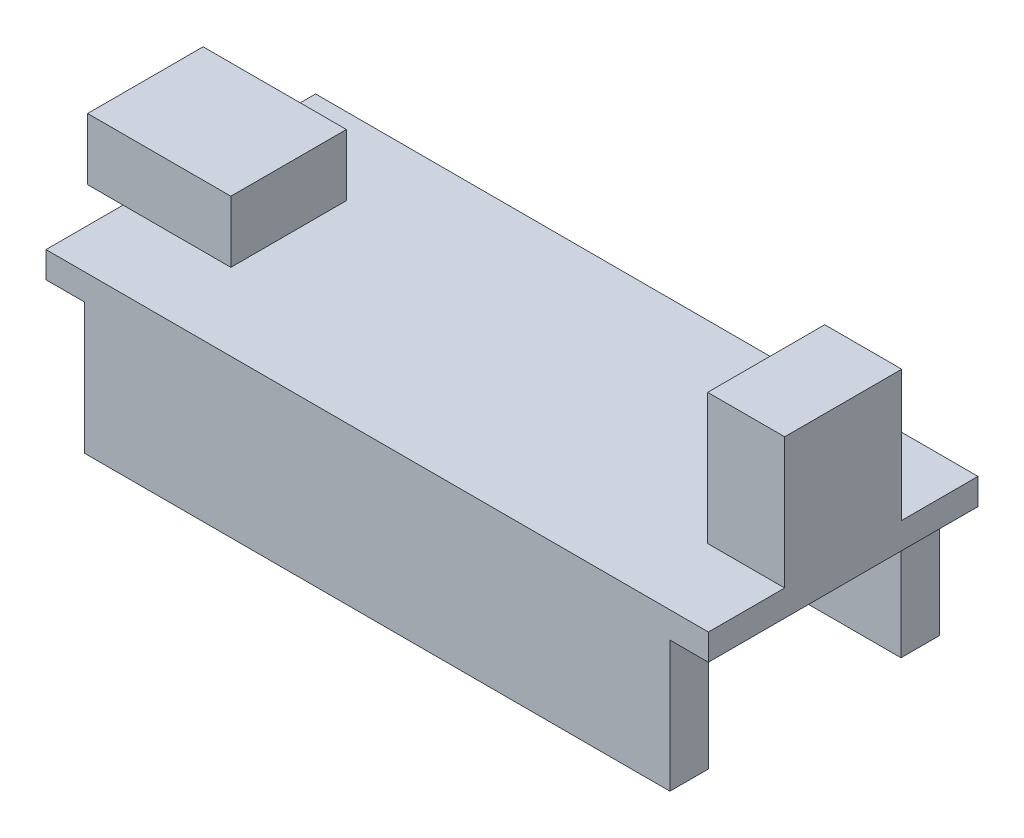
ISO-10303-21;
HEADER;
FILE_DESCRIPTION(('STEP AP214'),'2;1');
FILE_NAME('part.step','',(''),(''),'','','');
FILE_SCHEMA(('AUTOMOTIVE_DESIGN { 1 0 10303 214 1 1 1 1 }'));
ENDSEC;
DATA;
#1=APPLICATION_CONTEXT('core data for automotive mechanical design processes');
#2=APPLICATION_PROTOCOL_DEFINITION('international standard','automotive_design',2000,#1);
#3=PRODUCT_CONTEXT('',#1,'mechanical');
#4=PRODUCT('Part','Part','',(#3));
#5=PRODUCT_RELATED_PRODUCT_CATEGORY('part','',(#4));
#6=PRODUCT_DEFINITION_FORMATION('','',#4);
#7=PRODUCT_DEFINITION_CONTEXT('part definition',#1,'design');
#8=PRODUCT_DEFINITION('design','',#6,#7);
#9=PRODUCT_DEFINITION_SHAPE('','',#8);
#10=(LENGTH_UNIT() NAMED_UNIT(*) SI_UNIT(.MILLI.,.METRE.));
#11=(NAMED_UNIT(*) PLANE_ANGLE_UNIT() SI_UNIT($,.RADIAN.));
#12=(NAMED_UNIT(*) SI_UNIT($,.STERADIAN.) SOLID_ANGLE_UNIT());
#13=UNCERTAINTY_MEASURE_WITH_UNIT(LENGTH_MEASURE(1.E-05),#10,'distance_accuracy_value','');
#14=(GEOMETRIC_REPRESENTATION_CONTEXT(3) GLOBAL_UNCERTAINTY_ASSIGNED_CONTEXT((#13)) GLOBAL_UNIT_ASSIGNED_CONTEXT((#10,
#11,#12)) REPRESENTATION_CONTEXT('',''));
#15=CARTESIAN_POINT('',(0.,0.,0.));
#16=DIRECTION('',(0.,0.,1.));
#17=DIRECTION('',(1.,0.,0.));
#18=AXIS2_PLACEMENT_3D('',#15,#16,#17);
#19=CARTESIAN_POINT('',(0.,0.,0.));
#20=DIRECTION('',(0.,1.,0.));
#21=DIRECTION('',(0.,0.,1.));
#22=AXIS2_PLACEMENT_3D('',#19,#20,#21);
#23=PLANE('',#22);
#24=DIRECTION('',(0.,0.,-1.));
#25=VECTOR('',#24,1.);
#26=CARTESIAN_POINT('',(-19.,0.,-8.75));
#27=LINE('',#26,#25);
#28=CARTESIAN_POINT('',(-19.,0.,-6.25));
#29=VERTEX_POINT('',#28);
#30=CARTESIAN_POINT('',(-19.,0.,-8.75));
#31=VERTEX_POINT('',#30);
#32=EDGE_CURVE('E52',#29,#31,#27,.T.);
#33=ORIENTED_EDGE('',*,*,#32,.F.);
#34=DIRECTION('',(-1.,0.,0.));
#35=VECTOR('',#34,1.);
#36=CARTESIAN_POINT('',(-19.,0.,-6.25));
#37=LINE('',#36,#35);
#38=CARTESIAN_POINT('',(19.,0.,-6.25));
#39=VERTEX_POINT('',#38);
#40=EDGE_CURVE('E198',#39,#29,#37,.T.);
#41=ORIENTED_EDGE('',*,*,#40,.F.);
#42=DIRECTION('',(0.,0.,1.));
#43=VECTOR('',#42,1.);
#44=CARTESIAN_POINT('',(19.,0.,-8.75));
#45=LINE('',#44,#43);
#46=CARTESIAN_POINT('',(19.,0.,-8.75));
#47=VERTEX_POINT('',#46);
#48=EDGE_CURVE('E312',#47,#39,#45,.T.);
#49=ORIENTED_EDGE('',*,*,#48,.F.);
#50=DIRECTION('',(-1.,0.,0.));
#51=VECTOR('',#50,1.);
#52=CARTESIAN_POINT('',(-21.5,0.,-8.75));
#53=LINE('',#52,#51);
#54=CARTESIAN_POINT('',(21.5,0.,-8.75));
#55=VERTEX_POINT('',#54);
#56=EDGE_CURVE('E287',#55,#47,#53,.T.);
#57=ORIENTED_EDGE('',*,*,#56,.F.);
#58=DIRECTION('',(0.,0.,-1.));
#59=VECTOR('',#58,1.);
#60=CARTESIAN_POINT('',(21.5,0.,-8.75));
#61=LINE('',#60,#59);
#62=CARTESIAN_POINT('',(21.5,0.,8.75));
#63=VERTEX_POINT('',#62);
#64=EDGE_CURVE('E283',#63,#55,#61,.T.);
#65=ORIENTED_EDGE('',*,*,#64,.F.);
#66=DIRECTION('',(1.,0.,0.));
#67=VECTOR('',#66,1.);
#68=CARTESIAN_POINT('',(-21.5,0.,8.75));
#69=LINE('',#68,#67);
#70=CARTESIAN_POINT('',(19.,0.,8.75));
#71=VERTEX_POINT('',#70);
#72=EDGE_CURVE('E244',#71,#63,#69,.T.);
#73=ORIENTED_EDGE('',*,*,#72,.F.);
#74=DIRECTION('',(0.,0.,1.));
#75=VECTOR('',#74,1.);
#76=CARTESIAN_POINT('',(19.,0.,8.75));
#77=LINE('',#76,#75);
#78=CARTESIAN_POINT('',(19.,0.,6.25));
#79=VERTEX_POINT('',#78);
#80=EDGE_CURVE('E213',#79,#71,#77,.T.);
#81=ORIENTED_EDGE('',*,*,#80,.F.);
#82=DIRECTION('',(1.,0.,0.));
#83=VECTOR('',#82,1.);
#84=CARTESIAN_POINT('',(-19.,0.,6.25));
#85=LINE('',#84,#83);
#86=CARTESIAN_POINT('',(-19.,0.,6.25));
#87=VERTEX_POINT('',#86);
#88=EDGE_CURVE('E60',#87,#79,#85,.T.);
#89=ORIENTED_EDGE('',*,*,#88,.F.);
#90=DIRECTION('',(0.,0.,-1.));
#91=VECTOR('',#90,1.);
#92=CARTESIAN_POINT('',(-19.,0.,8.75));
#93=LINE('',#92,#91);
#94=CARTESIAN_POINT('',(-19.,0.,8.75));
#95=VERTEX_POINT('',#94);
#96=EDGE_CURVE('E201',#95,#87,#93,.T.);
#97=ORIENTED_EDGE('',*,*,#96,.F.);
#98=CARTESIAN_POINT('',(-21.5,0.,8.75));
#99=VERTEX_POINT('',#98);
#100=EDGE_CURVE('E247',#99,#95,#69,.T.);
#101=ORIENTED_EDGE('',*,*,#100,.F.);
#102=DIRECTION('',(0.,0.,1.));
#103=VECTOR('',#102,1.);
#104=CARTESIAN_POINT('',(-21.5,0.,-8.75));
#105=LINE('',#104,#103);
#106=CARTESIAN_POINT('',(-21.5,0.,-8.75));
#107=VERTEX_POINT('',#106);
#108=EDGE_CURVE('E248',#107,#99,#105,.T.);
#109=ORIENTED_EDGE('',*,*,#108,.F.);
#110=EDGE_CURVE('E285',#31,#107,#53,.T.);
#111=ORIENTED_EDGE('',*,*,#110,.F.);
#112=EDGE_LOOP('',(#33,#41,#49,#57,#65,#73,#81,#89,#97,#101,#109,#111));
#113=FACE_BOUND('',#112,.T.);
#114=ADVANCED_FACE('F35',(#113),#23,.F.);
#115=CARTESIAN_POINT('',(0.,1.7,0.));
#116=DIRECTION('',(0.,1.,0.));
#117=DIRECTION('',(0.,0.,1.));
#118=AXIS2_PLACEMENT_3D('',#115,#116,#117);
#119=PLANE('',#118);
#120=DIRECTION('',(-1.,0.,0.));
#121=VECTOR('',#120,1.);
#122=CARTESIAN_POINT('',(0.,1.7,3.75));
#123=LINE('',#122,#121);
#124=CARTESIAN_POINT('',(-14.5,1.7,3.75));
#125=VERTEX_POINT('',#124);
#126=CARTESIAN_POINT('',(-21.5,1.7,3.75));
#127=VERTEX_POINT('',#126);
#128=EDGE_CURVE('E571',#125,#127,#123,.T.);
#129=ORIENTED_EDGE('',*,*,#128,.T.);
#130=DIRECTION('',(0.,0.,1.));
#131=VECTOR('',#130,1.);
#132=CARTESIAN_POINT('',(-21.5,1.7,-8.75));
#133=LINE('',#132,#131);
#134=CARTESIAN_POINT('',(-21.5,1.7,8.75));
#135=VERTEX_POINT('',#134);
#136=EDGE_CURVE('E277',#127,#135,#133,.T.);
#137=ORIENTED_EDGE('',*,*,#136,.T.);
#138=DIRECTION('',(1.,0.,0.));
#139=VECTOR('',#138,1.);
#140=CARTESIAN_POINT('',(-21.5,1.7,8.75));
#141=LINE('',#140,#139);
#142=CARTESIAN_POINT('',(21.5,1.7,8.75));
#143=VERTEX_POINT('',#142);
#144=EDGE_CURVE('E259',#135,#143,#141,.T.);
#145=ORIENTED_EDGE('',*,*,#144,.T.);
#146=DIRECTION('',(0.,0.,-1.));
#147=VECTOR('',#146,1.);
#148=CARTESIAN_POINT('',(21.5,1.7,-8.75));
#149=LINE('',#148,#147);
#150=CARTESIAN_POINT('',(21.5,1.7,3.8));
#151=VERTEX_POINT('',#150);
#152=EDGE_CURVE('E264',#143,#151,#149,.T.);
#153=ORIENTED_EDGE('',*,*,#152,.T.);
#154=DIRECTION('',(-1.,0.,0.));
#155=VECTOR('',#154,1.);
#156=CARTESIAN_POINT('',(0.,1.7,3.8));
#157=LINE('',#156,#155);
#158=CARTESIAN_POINT('',(16.5,1.7,3.8));
#159=VERTEX_POINT('',#158);
#160=EDGE_CURVE('E551',#151,#159,#157,.T.);
#161=ORIENTED_EDGE('',*,*,#160,.T.);
#162=DIRECTION('',(0.,0.,1.));
#163=VECTOR('',#162,1.);
#164=CARTESIAN_POINT('',(16.5,1.7,0.));
#165=LINE('',#164,#163);
#166=CARTESIAN_POINT('',(16.5,1.7,-3.8));
#167=VERTEX_POINT('',#166);
#168=EDGE_CURVE('E533',#167,#159,#165,.T.);
#169=ORIENTED_EDGE('',*,*,#168,.F.);
#170=DIRECTION('',(-1.,0.,0.));
#171=VECTOR('',#170,1.);
#172=CARTESIAN_POINT('',(0.,1.7,-3.8));
#173=LINE('',#172,#171);
#174=CARTESIAN_POINT('',(21.5,1.7,-3.8));
#175=VERTEX_POINT('',#174);
#176=EDGE_CURVE('E302',#175,#167,#173,.T.);
#177=ORIENTED_EDGE('',*,*,#176,.F.);
#178=CARTESIAN_POINT('',(21.5,1.7,-8.75));
#179=VERTEX_POINT('',#178);
#180=EDGE_CURVE('E268',#175,#179,#149,.T.);
#181=ORIENTED_EDGE('',*,*,#180,.T.);
#182=DIRECTION('',(-1.,0.,0.));
#183=VECTOR('',#182,1.);
#184=CARTESIAN_POINT('',(-21.5,1.7,-8.75));
#185=LINE('',#184,#183);
#186=CARTESIAN_POINT('',(-21.5,1.7,-8.75));
#187=VERTEX_POINT('',#186);
#188=EDGE_CURVE('E267',#179,#187,#185,.T.);
#189=ORIENTED_EDGE('',*,*,#188,.T.);
#190=CARTESIAN_POINT('',(-21.5,1.7,-3.75));
#191=VERTEX_POINT('',#190);
#192=EDGE_CURVE('E278',#187,#191,#133,.T.);
#193=ORIENTED_EDGE('',*,*,#192,.T.);
#194=DIRECTION('',(-1.,0.,0.));
#195=VECTOR('',#194,1.);
#196=CARTESIAN_POINT('',(0.,1.7,-3.75));
#197=LINE('',#196,#195);
#198=CARTESIAN_POINT('',(-14.5,1.7,-3.75));
#199=VERTEX_POINT('',#198);
#200=EDGE_CURVE('E591',#199,#191,#197,.T.);
#201=ORIENTED_EDGE('',*,*,#200,.F.);
#202=DIRECTION('',(0.,0.,1.));
#203=VECTOR('',#202,1.);
#204=CARTESIAN_POINT('',(-14.5,1.7,0.));
#205=LINE('',#204,#203);
#206=EDGE_CURVE('E573',#199,#125,#205,.T.);
#207=ORIENTED_EDGE('',*,*,#206,.T.);
#208=EDGE_LOOP('',(#129,#137,#145,#153,#161,#169,#177,#181,#189,#193,#201,#207));
#209=FACE_BOUND('',#208,.T.);
#210=ADVANCED_FACE('F300',(#209),#119,.T.);
#211=CARTESIAN_POINT('',(21.5,1.7,-8.75));
#212=DIRECTION('',(-1.,0.,0.));
#213=DIRECTION('',(0.,0.,1.));
#214=AXIS2_PLACEMENT_3D('',#211,#212,#213);
#215=PLANE('',#214);
#216=ORIENTED_EDGE('',*,*,#64,.T.);
#217=DIRECTION('',(0.,-1.,0.));
#218=VECTOR('',#217,1.);
#219=CARTESIAN_POINT('',(21.5,1.7,-8.75));
#220=LINE('',#219,#218);
#221=EDGE_CURVE('E11',#179,#55,#220,.T.);
#222=ORIENTED_EDGE('',*,*,#221,.F.);
#223=ORIENTED_EDGE('',*,*,#180,.F.);
#224=DIRECTION('',(0.,-1.,0.));
#225=VECTOR('',#224,1.);
#226=CARTESIAN_POINT('',(21.5,10.2,-3.8));
#227=LINE('',#226,#225);
#228=CARTESIAN_POINT('',(21.5,10.2,-3.8));
#229=VERTEX_POINT('',#228);
#230=EDGE_CURVE('E286',#229,#175,#227,.T.);
#231=ORIENTED_EDGE('',*,*,#230,.F.);
#232=DIRECTION('',(0.,0.,-1.));
#233=VECTOR('',#232,1.);
#234=CARTESIAN_POINT('',(21.5,10.2,0.));
#235=LINE('',#234,#233);
#236=CARTESIAN_POINT('',(21.5,10.2,3.8));
#237=VERTEX_POINT('',#236);
#238=EDGE_CURVE('E553',#237,#229,#235,.T.);
#239=ORIENTED_EDGE('',*,*,#238,.F.);
#240=DIRECTION('',(0.,-1.,0.));
#241=VECTOR('',#240,1.);
#242=CARTESIAN_POINT('',(21.5,10.2,3.8));
#243=LINE('',#242,#241);
#244=EDGE_CURVE('E541',#237,#151,#243,.T.);
#245=ORIENTED_EDGE('',*,*,#244,.T.);
#246=ORIENTED_EDGE('',*,*,#152,.F.);
#247=DIRECTION('',(0.,-1.,0.));
#248=VECTOR('',#247,1.);
#249=CARTESIAN_POINT('',(21.5,1.7,8.75));
#250=LINE('',#249,#248);
#251=EDGE_CURVE('E254',#143,#63,#250,.T.);
#252=ORIENTED_EDGE('',*,*,#251,.T.);
#253=EDGE_LOOP('',(#216,#222,#223,#231,#239,#245,#246,#252));
#254=FACE_BOUND('',#253,.T.);
#255=ADVANCED_FACE('F37',(#254),#215,.F.);
#256=CARTESIAN_POINT('',(-21.5,1.7,-8.75));
#257=DIRECTION('',(0.,0.,1.));
#258=DIRECTION('',(1.,0.,0.));
#259=AXIS2_PLACEMENT_3D('',#256,#257,#258);
#260=PLANE('',#259);
#261=ORIENTED_EDGE('',*,*,#56,.T.);
#262=DIRECTION('',(0.,1.,0.));
#263=VECTOR('',#262,1.);
#264=CARTESIAN_POINT('',(19.,-8.5,-8.75));
#265=LINE('',#264,#263);
#266=CARTESIAN_POINT('',(19.,-8.5,-8.75));
#267=VERTEX_POINT('',#266);
#268=EDGE_CURVE('E187',#267,#47,#265,.T.);
#269=ORIENTED_EDGE('',*,*,#268,.F.);
#270=DIRECTION('',(1.,0.,0.));
#271=VECTOR('',#270,1.);
#272=CARTESIAN_POINT('',(-19.,-8.5,-8.75));
#273=LINE('',#272,#271);
#274=CARTESIAN_POINT('',(-19.,-8.5,-8.75));
#275=VERTEX_POINT('',#274);
#276=EDGE_CURVE('E181',#275,#267,#273,.T.);
#277=ORIENTED_EDGE('',*,*,#276,.F.);
#278=DIRECTION('',(0.,1.,0.));
#279=VECTOR('',#278,1.);
#280=CARTESIAN_POINT('',(-19.,-8.5,-8.75));
#281=LINE('',#280,#279);
#282=EDGE_CURVE('E185',#275,#31,#281,.T.);
#283=ORIENTED_EDGE('',*,*,#282,.T.);
#284=ORIENTED_EDGE('',*,*,#110,.T.);
#285=DIRECTION('',(0.,-1.,0.));
#286=VECTOR('',#285,1.);
#287=CARTESIAN_POINT('',(-21.5,1.7,-8.75));
#288=LINE('',#287,#286);
#289=EDGE_CURVE('E44',#187,#107,#288,.T.);
#290=ORIENTED_EDGE('',*,*,#289,.F.);
#291=ORIENTED_EDGE('',*,*,#188,.F.);
#292=ORIENTED_EDGE('',*,*,#221,.T.);
#293=EDGE_LOOP('',(#261,#269,#277,#283,#284,#290,#291,#292));
#294=FACE_BOUND('',#293,.T.);
#295=ADVANCED_FACE('F184',(#294),#260,.F.);
#296=CARTESIAN_POINT('',(-21.5,1.7,-8.75));
#297=DIRECTION('',(1.,0.,0.));
#298=DIRECTION('',(0.,0.,-1.));
#299=AXIS2_PLACEMENT_3D('',#296,#297,#298);
#300=PLANE('',#299);
#301=ORIENTED_EDGE('',*,*,#108,.T.);
#302=DIRECTION('',(0.,-1.,0.));
#303=VECTOR('',#302,1.);
#304=CARTESIAN_POINT('',(-21.5,1.7,8.75));
#305=LINE('',#304,#303);
#306=EDGE_CURVE('E258',#135,#99,#305,.T.);
#307=ORIENTED_EDGE('',*,*,#306,.F.);
#308=ORIENTED_EDGE('',*,*,#136,.F.);
#309=EDGE_CURVE('E281',#191,#127,#133,.T.);
#310=ORIENTED_EDGE('',*,*,#309,.F.);
#311=ORIENTED_EDGE('',*,*,#192,.F.);
#312=ORIENTED_EDGE('',*,*,#289,.T.);
#313=EDGE_LOOP('',(#301,#307,#308,#310,#311,#312));
#314=FACE_BOUND('',#313,.T.);
#315=ADVANCED_FACE('F293',(#314),#300,.F.);
#316=CARTESIAN_POINT('',(-21.5,1.7,8.75));
#317=DIRECTION('',(0.,0.,-1.));
#318=DIRECTION('',(-1.,0.,0.));
#319=AXIS2_PLACEMENT_3D('',#316,#317,#318);
#320=PLANE('',#319);
#321=ORIENTED_EDGE('',*,*,#100,.T.);
#322=DIRECTION('',(0.,1.,0.));
#323=VECTOR('',#322,1.);
#324=CARTESIAN_POINT('',(-19.,-8.5,8.75));
#325=LINE('',#324,#323);
#326=CARTESIAN_POINT('',(-19.,-8.5,8.75));
#327=VERTEX_POINT('',#326);
#328=EDGE_CURVE('E219',#327,#95,#325,.T.);
#329=ORIENTED_EDGE('',*,*,#328,.F.);
#330=DIRECTION('',(-1.,0.,0.));
#331=VECTOR('',#330,1.);
#332=CARTESIAN_POINT('',(-19.,-8.5,8.75));
#333=LINE('',#332,#331);
#334=CARTESIAN_POINT('',(19.,-8.5,8.75));
#335=VERTEX_POINT('',#334);
#336=EDGE_CURVE('E217',#335,#327,#333,.T.);
#337=ORIENTED_EDGE('',*,*,#336,.F.);
#338=DIRECTION('',(0.,1.,0.));
#339=VECTOR('',#338,1.);
#340=CARTESIAN_POINT('',(19.,-8.5,8.75));
#341=LINE('',#340,#339);
#342=EDGE_CURVE('E230',#335,#71,#341,.T.);
#343=ORIENTED_EDGE('',*,*,#342,.T.);
#344=ORIENTED_EDGE('',*,*,#72,.T.);
#345=ORIENTED_EDGE('',*,*,#251,.F.);
#346=ORIENTED_EDGE('',*,*,#144,.F.);
#347=ORIENTED_EDGE('',*,*,#306,.T.);
#348=EDGE_LOOP('',(#321,#329,#337,#343,#344,#345,#346,#347));
#349=FACE_BOUND('',#348,.T.);
#350=ADVANCED_FACE('F343',(#349),#320,.F.);
#351=CARTESIAN_POINT('',(0.,10.2,-3.8));
#352=DIRECTION('',(0.,0.,1.));
#353=DIRECTION('',(1.,0.,0.));
#354=AXIS2_PLACEMENT_3D('',#351,#352,#353);
#355=PLANE('',#354);
#356=ORIENTED_EDGE('',*,*,#176,.T.);
#357=DIRECTION('',(0.,-1.,0.));
#358=VECTOR('',#357,1.);
#359=CARTESIAN_POINT('',(16.5,10.2,-3.8));
#360=LINE('',#359,#358);
#361=CARTESIAN_POINT('',(16.5,10.2,-3.8));
#362=VERTEX_POINT('',#361);
#363=EDGE_CURVE('E273',#362,#167,#360,.T.);
#364=ORIENTED_EDGE('',*,*,#363,.F.);
#365=DIRECTION('',(-1.,0.,0.));
#366=VECTOR('',#365,1.);
#367=CARTESIAN_POINT('',(0.,10.2,-3.8));
#368=LINE('',#367,#366);
#369=EDGE_CURVE('E560',#229,#362,#368,.T.);
#370=ORIENTED_EDGE('',*,*,#369,.F.);
#371=ORIENTED_EDGE('',*,*,#230,.T.);
#372=EDGE_LOOP('',(#356,#364,#370,#371));
#373=FACE_BOUND('',#372,.T.);
#374=ADVANCED_FACE('F346',(#373),#355,.F.);
#375=CARTESIAN_POINT('',(16.5,10.2,0.));
#376=DIRECTION('',(1.,0.,0.));
#377=DIRECTION('',(0.,0.,-1.));
#378=AXIS2_PLACEMENT_3D('',#375,#376,#377);
#379=PLANE('',#378);
#380=ORIENTED_EDGE('',*,*,#168,.T.);
#381=DIRECTION('',(0.,-1.,0.));
#382=VECTOR('',#381,1.);
#383=CARTESIAN_POINT('',(16.5,10.2,3.8));
#384=LINE('',#383,#382);
#385=CARTESIAN_POINT('',(16.5,10.2,3.8));
#386=VERTEX_POINT('',#385);
#387=EDGE_CURVE('E538',#386,#159,#384,.T.);
#388=ORIENTED_EDGE('',*,*,#387,.F.);
#389=DIRECTION('',(0.,0.,1.));
#390=VECTOR('',#389,1.);
#391=CARTESIAN_POINT('',(16.5,10.2,0.));
#392=LINE('',#391,#390);
#393=EDGE_CURVE('E537',#362,#386,#392,.T.);
#394=ORIENTED_EDGE('',*,*,#393,.F.);
#395=ORIENTED_EDGE('',*,*,#363,.T.);
#396=EDGE_LOOP('',(#380,#388,#394,#395));
#397=FACE_BOUND('',#396,.T.);
#398=ADVANCED_FACE('F524',(#397),#379,.F.);
#399=CARTESIAN_POINT('',(0.,10.2,3.8));
#400=DIRECTION('',(0.,0.,1.));
#401=DIRECTION('',(1.,0.,0.));
#402=AXIS2_PLACEMENT_3D('',#399,#400,#401);
#403=PLANE('',#402);
#404=ORIENTED_EDGE('',*,*,#160,.F.);
#405=ORIENTED_EDGE('',*,*,#244,.F.);
#406=DIRECTION('',(-1.,0.,0.));
#407=VECTOR('',#406,1.);
#408=CARTESIAN_POINT('',(0.,10.2,3.8));
#409=LINE('',#408,#407);
#410=EDGE_CURVE('E545',#237,#386,#409,.T.);
#411=ORIENTED_EDGE('',*,*,#410,.T.);
#412=ORIENTED_EDGE('',*,*,#387,.T.);
#413=EDGE_LOOP('',(#404,#405,#411,#412));
#414=FACE_BOUND('',#413,.T.);
#415=ADVANCED_FACE('F520',(#414),#403,.T.);
#416=CARTESIAN_POINT('',(0.,10.2,0.));
#417=DIRECTION('',(0.,1.,0.));
#418=DIRECTION('',(0.,0.,1.));
#419=AXIS2_PLACEMENT_3D('',#416,#417,#418);
#420=PLANE('',#419);
#421=ORIENTED_EDGE('',*,*,#238,.T.);
#422=ORIENTED_EDGE('',*,*,#369,.T.);
#423=ORIENTED_EDGE('',*,*,#393,.T.);
#424=ORIENTED_EDGE('',*,*,#410,.F.);
#425=EDGE_LOOP('',(#421,#422,#423,#424));
#426=FACE_BOUND('',#425,.T.);
#427=ADVANCED_FACE('F367',(#426),#420,.T.);
#428=CARTESIAN_POINT('',(0.,1.7,0.));
#429=DIRECTION('',(0.,1.,0.));
#430=DIRECTION('',(0.,0.,1.));
#431=AXIS2_PLACEMENT_3D('',#428,#429,#430);
#432=PLANE('',#431);
#433=CARTESIAN_POINT('',(-23.8,1.7,-3.75));
#434=VERTEX_POINT('',#433);
#435=EDGE_CURVE('E581',#191,#434,#197,.T.);
#436=ORIENTED_EDGE('',*,*,#435,.F.);
#437=ORIENTED_EDGE('',*,*,#309,.T.);
#438=CARTESIAN_POINT('',(-23.8,1.7,3.75));
#439=VERTEX_POINT('',#438);
#440=EDGE_CURVE('E576',#127,#439,#123,.T.);
#441=ORIENTED_EDGE('',*,*,#440,.T.);
#442=DIRECTION('',(0.,0.,1.));
#443=VECTOR('',#442,1.);
#444=CARTESIAN_POINT('',(-23.8,1.7,0.));
#445=LINE('',#444,#443);
#446=EDGE_CURVE('E586',#434,#439,#445,.T.);
#447=ORIENTED_EDGE('',*,*,#446,.F.);
#448=EDGE_LOOP('',(#436,#437,#441,#447));
#449=FACE_BOUND('',#448,.T.);
#450=ADVANCED_FACE('F379',(#449),#432,.F.);
#451=CARTESIAN_POINT('',(-23.8,5.7,0.));
#452=DIRECTION('',(1.,0.,0.));
#453=DIRECTION('',(0.,0.,-1.));
#454=AXIS2_PLACEMENT_3D('',#451,#452,#453);
#455=PLANE('',#454);
#456=ORIENTED_EDGE('',*,*,#446,.T.);
#457=DIRECTION('',(0.,-1.,0.));
#458=VECTOR('',#457,1.);
#459=CARTESIAN_POINT('',(-23.8,5.7,3.75));
#460=LINE('',#459,#458);
#461=CARTESIAN_POINT('',(-23.8,5.7,3.75));
#462=VERTEX_POINT('',#461);
#463=EDGE_CURVE('E534',#462,#439,#460,.T.);
#464=ORIENTED_EDGE('',*,*,#463,.F.);
#465=DIRECTION('',(0.,0.,1.));
#466=VECTOR('',#465,1.);
#467=CARTESIAN_POINT('',(-23.8,5.7,0.));
#468=LINE('',#467,#466);
#469=CARTESIAN_POINT('',(-23.8,5.7,-3.75));
#470=VERTEX_POINT('',#469);
#471=EDGE_CURVE('E593',#470,#462,#468,.T.);
#472=ORIENTED_EDGE('',*,*,#471,.F.);
#473=DIRECTION('',(0.,-1.,0.));
#474=VECTOR('',#473,1.);
#475=CARTESIAN_POINT('',(-23.8,5.7,-3.75));
#476=LINE('',#475,#474);
#477=EDGE_CURVE('E594',#470,#434,#476,.T.);
#478=ORIENTED_EDGE('',*,*,#477,.T.);
#479=EDGE_LOOP('',(#456,#464,#472,#478));
#480=FACE_BOUND('',#479,.T.);
#481=ADVANCED_FACE('F384',(#480),#455,.F.);
#482=CARTESIAN_POINT('',(0.,5.7,3.75));
#483=DIRECTION('',(0.,0.,1.));
#484=DIRECTION('',(1.,0.,0.));
#485=AXIS2_PLACEMENT_3D('',#482,#483,#484);
#486=PLANE('',#485);
#487=ORIENTED_EDGE('',*,*,#128,.F.);
#488=DIRECTION('',(0.,-1.,0.));
#489=VECTOR('',#488,1.);
#490=CARTESIAN_POINT('',(-14.5,5.7,3.75));
#491=LINE('',#490,#489);
#492=CARTESIAN_POINT('',(-14.5,5.7,3.75));
#493=VERTEX_POINT('',#492);
#494=EDGE_CURVE('E600',#493,#125,#491,.T.);
#495=ORIENTED_EDGE('',*,*,#494,.F.);
#496=DIRECTION('',(-1.,0.,0.));
#497=VECTOR('',#496,1.);
#498=CARTESIAN_POINT('',(0.,5.7,3.75));
#499=LINE('',#498,#497);
#500=EDGE_CURVE('E605',#493,#462,#499,.T.);
#501=ORIENTED_EDGE('',*,*,#500,.T.);
#502=ORIENTED_EDGE('',*,*,#463,.T.);
#503=ORIENTED_EDGE('',*,*,#440,.F.);
#504=EDGE_LOOP('',(#487,#495,#501,#502,#503));
#505=FACE_BOUND('',#504,.T.);
#506=ADVANCED_FACE('F395',(#505),#486,.T.);
#507=CARTESIAN_POINT('',(-14.5,5.7,0.));
#508=DIRECTION('',(1.,0.,0.));
#509=DIRECTION('',(0.,0.,-1.));
#510=AXIS2_PLACEMENT_3D('',#507,#508,#509);
#511=PLANE('',#510);
#512=ORIENTED_EDGE('',*,*,#206,.F.);
#513=DIRECTION('',(0.,-1.,0.));
#514=VECTOR('',#513,1.);
#515=CARTESIAN_POINT('',(-14.5,5.7,-3.75));
#516=LINE('',#515,#514);
#517=CARTESIAN_POINT('',(-14.5,5.7,-3.75));
#518=VERTEX_POINT('',#517);
#519=EDGE_CURVE('E597',#518,#199,#516,.T.);
#520=ORIENTED_EDGE('',*,*,#519,.F.);
#521=DIRECTION('',(0.,0.,1.));
#522=VECTOR('',#521,1.);
#523=CARTESIAN_POINT('',(-14.5,5.7,0.));
#524=LINE('',#523,#522);
#525=EDGE_CURVE('E603',#518,#493,#524,.T.);
#526=ORIENTED_EDGE('',*,*,#525,.T.);
#527=ORIENTED_EDGE('',*,*,#494,.T.);
#528=EDGE_LOOP('',(#512,#520,#526,#527));
#529=FACE_BOUND('',#528,.T.);
#530=ADVANCED_FACE('F405',(#529),#511,.T.);
#531=CARTESIAN_POINT('',(0.,5.7,-3.75));
#532=DIRECTION('',(0.,0.,1.));
#533=DIRECTION('',(1.,0.,0.));
#534=AXIS2_PLACEMENT_3D('',#531,#532,#533);
#535=PLANE('',#534);
#536=ORIENTED_EDGE('',*,*,#200,.T.);
#537=ORIENTED_EDGE('',*,*,#435,.T.);
#538=ORIENTED_EDGE('',*,*,#477,.F.);
#539=DIRECTION('',(-1.,0.,0.));
#540=VECTOR('',#539,1.);
#541=CARTESIAN_POINT('',(0.,5.7,-3.75));
#542=LINE('',#541,#540);
#543=EDGE_CURVE('E598',#518,#470,#542,.T.);
#544=ORIENTED_EDGE('',*,*,#543,.F.);
#545=ORIENTED_EDGE('',*,*,#519,.T.);
#546=EDGE_LOOP('',(#536,#537,#538,#544,#545));
#547=FACE_BOUND('',#546,.T.);
#548=ADVANCED_FACE('F415',(#547),#535,.F.);
#549=CARTESIAN_POINT('',(0.,5.7,0.));
#550=DIRECTION('',(0.,1.,0.));
#551=DIRECTION('',(0.,0.,1.));
#552=AXIS2_PLACEMENT_3D('',#549,#550,#551);
#553=PLANE('',#552);
#554=ORIENTED_EDGE('',*,*,#471,.T.);
#555=ORIENTED_EDGE('',*,*,#500,.F.);
#556=ORIENTED_EDGE('',*,*,#525,.F.);
#557=ORIENTED_EDGE('',*,*,#543,.T.);
#558=EDGE_LOOP('',(#554,#555,#556,#557));
#559=FACE_BOUND('',#558,.T.);
#560=ADVANCED_FACE('F425',(#559),#553,.T.);
#561=CARTESIAN_POINT('',(-19.,-8.5,8.75));
#562=DIRECTION('',(1.,0.,0.));
#563=DIRECTION('',(0.,0.,-1.));
#564=AXIS2_PLACEMENT_3D('',#561,#562,#563);
#565=PLANE('',#564);
#566=ORIENTED_EDGE('',*,*,#96,.T.);
#567=DIRECTION('',(0.,1.,0.));
#568=VECTOR('',#567,1.);
#569=CARTESIAN_POINT('',(-19.,-8.5,6.25));
#570=LINE('',#569,#568);
#571=CARTESIAN_POINT('',(-19.,-8.5,6.25));
#572=VERTEX_POINT('',#571);
#573=EDGE_CURVE('E236',#572,#87,#570,.T.);
#574=ORIENTED_EDGE('',*,*,#573,.F.);
#575=DIRECTION('',(0.,0.,-1.));
#576=VECTOR('',#575,1.);
#577=CARTESIAN_POINT('',(-19.,-8.5,8.75));
#578=LINE('',#577,#576);
#579=EDGE_CURVE('E209',#327,#572,#578,.T.);
#580=ORIENTED_EDGE('',*,*,#579,.F.);
#581=ORIENTED_EDGE('',*,*,#328,.T.);
#582=EDGE_LOOP('',(#566,#574,#580,#581));
#583=FACE_BOUND('',#582,.T.);
#584=ADVANCED_FACE('F435',(#583),#565,.F.);
#585=CARTESIAN_POINT('',(-19.,-8.5,6.25));
#586=DIRECTION('',(0.,0.,1.));
#587=DIRECTION('',(1.,0.,0.));
#588=AXIS2_PLACEMENT_3D('',#585,#586,#587);
#589=PLANE('',#588);
#590=ORIENTED_EDGE('',*,*,#88,.T.);
#591=DIRECTION('',(0.,1.,0.));
#592=VECTOR('',#591,1.);
#593=CARTESIAN_POINT('',(19.,-8.5,6.25));
#594=LINE('',#593,#592);
#595=CARTESIAN_POINT('',(19.,-8.5,6.25));
#596=VERTEX_POINT('',#595);
#597=EDGE_CURVE('E223',#596,#79,#594,.T.);
#598=ORIENTED_EDGE('',*,*,#597,.F.);
#599=DIRECTION('',(1.,0.,0.));
#600=VECTOR('',#599,1.);
#601=CARTESIAN_POINT('',(-19.,-8.5,6.25));
#602=LINE('',#601,#600);
#603=EDGE_CURVE('E212',#572,#596,#602,.T.);
#604=ORIENTED_EDGE('',*,*,#603,.F.);
#605=ORIENTED_EDGE('',*,*,#573,.T.);
#606=EDGE_LOOP('',(#590,#598,#604,#605));
#607=FACE_BOUND('',#606,.T.);
#608=ADVANCED_FACE('F462',(#607),#589,.F.);
#609=CARTESIAN_POINT('',(19.,-8.5,8.75));
#610=DIRECTION('',(-1.,0.,0.));
#611=DIRECTION('',(0.,0.,1.));
#612=AXIS2_PLACEMENT_3D('',#609,#610,#611);
#613=PLANE('',#612);
#614=ORIENTED_EDGE('',*,*,#80,.T.);
#615=ORIENTED_EDGE('',*,*,#342,.F.);
#616=DIRECTION('',(0.,0.,1.));
#617=VECTOR('',#616,1.);
#618=CARTESIAN_POINT('',(19.,-8.5,8.75));
#619=LINE('',#618,#617);
#620=EDGE_CURVE('E215',#596,#335,#619,.T.);
#621=ORIENTED_EDGE('',*,*,#620,.F.);
#622=ORIENTED_EDGE('',*,*,#597,.T.);
#623=EDGE_LOOP('',(#614,#615,#621,#622));
#624=FACE_BOUND('',#623,.T.);
#625=ADVANCED_FACE('F471',(#624),#613,.F.);
#626=CARTESIAN_POINT('',(0.,-8.5,0.));
#627=DIRECTION('',(0.,-1.,0.));
#628=DIRECTION('',(0.,0.,-1.));
#629=AXIS2_PLACEMENT_3D('',#626,#627,#628);
#630=PLANE('',#629);
#631=ORIENTED_EDGE('',*,*,#579,.T.);
#632=ORIENTED_EDGE('',*,*,#603,.T.);
#633=ORIENTED_EDGE('',*,*,#620,.T.);
#634=ORIENTED_EDGE('',*,*,#336,.T.);
#635=EDGE_LOOP('',(#631,#632,#633,#634));
#636=FACE_BOUND('',#635,.T.);
#637=ADVANCED_FACE('F333',(#636),#630,.T.);
#638=CARTESIAN_POINT('',(-19.,-8.5,-8.75));
#639=DIRECTION('',(1.,0.,0.));
#640=DIRECTION('',(0.,0.,-1.));
#641=AXIS2_PLACEMENT_3D('',#638,#639,#640);
#642=PLANE('',#641);
#643=ORIENTED_EDGE('',*,*,#32,.T.);
#644=ORIENTED_EDGE('',*,*,#282,.F.);
#645=DIRECTION('',(0.,0.,-1.));
#646=VECTOR('',#645,1.);
#647=CARTESIAN_POINT('',(-19.,-8.5,-8.75));
#648=LINE('',#647,#646);
#649=CARTESIAN_POINT('',(-19.,-8.5,-6.25));
#650=VERTEX_POINT('',#649);
#651=EDGE_CURVE('E191',#650,#275,#648,.T.);
#652=ORIENTED_EDGE('',*,*,#651,.F.);
#653=DIRECTION('',(0.,1.,0.));
#654=VECTOR('',#653,1.);
#655=CARTESIAN_POINT('',(-19.,-8.5,-6.25));
#656=LINE('',#655,#654);
#657=EDGE_CURVE('E321',#650,#29,#656,.T.);
#658=ORIENTED_EDGE('',*,*,#657,.T.);
#659=EDGE_LOOP('',(#643,#644,#652,#658));
#660=FACE_BOUND('',#659,.T.);
#661=ADVANCED_FACE('F200',(#660),#642,.F.);
#662=CARTESIAN_POINT('',(19.,-8.5,-8.75));
#663=DIRECTION('',(-1.,0.,0.));
#664=DIRECTION('',(0.,0.,1.));
#665=AXIS2_PLACEMENT_3D('',#662,#663,#664);
#666=PLANE('',#665);
#667=ORIENTED_EDGE('',*,*,#48,.T.);
#668=DIRECTION('',(0.,1.,0.));
#669=VECTOR('',#668,1.);
#670=CARTESIAN_POINT('',(19.,-8.5,-6.25));
#671=LINE('',#670,#669);
#672=CARTESIAN_POINT('',(19.,-8.5,-6.25));
#673=VERTEX_POINT('',#672);
#674=EDGE_CURVE('E205',#673,#39,#671,.T.);
#675=ORIENTED_EDGE('',*,*,#674,.F.);
#676=DIRECTION('',(0.,0.,1.));
#677=VECTOR('',#676,1.);
#678=CARTESIAN_POINT('',(19.,-8.5,-8.75));
#679=LINE('',#678,#677);
#680=EDGE_CURVE('E190',#267,#673,#679,.T.);
#681=ORIENTED_EDGE('',*,*,#680,.F.);
#682=ORIENTED_EDGE('',*,*,#268,.T.);
#683=EDGE_LOOP('',(#667,#675,#681,#682));
#684=FACE_BOUND('',#683,.T.);
#685=ADVANCED_FACE('F324',(#684),#666,.F.);
#686=CARTESIAN_POINT('',(-19.,-8.5,-6.25));
#687=DIRECTION('',(0.,0.,-1.));
#688=DIRECTION('',(-1.,0.,0.));
#689=AXIS2_PLACEMENT_3D('',#686,#687,#688);
#690=PLANE('',#689);
#691=ORIENTED_EDGE('',*,*,#40,.T.);
#692=ORIENTED_EDGE('',*,*,#657,.F.);
#693=DIRECTION('',(-1.,0.,0.));
#694=VECTOR('',#693,1.);
#695=CARTESIAN_POINT('',(-19.,-8.5,-6.25));
#696=LINE('',#695,#694);
#697=EDGE_CURVE('E196',#673,#650,#696,.T.);
#698=ORIENTED_EDGE('',*,*,#697,.F.);
#699=ORIENTED_EDGE('',*,*,#674,.T.);
#700=EDGE_LOOP('',(#691,#692,#698,#699));
#701=FACE_BOUND('',#700,.T.);
#702=ADVANCED_FACE('F323',(#701),#690,.F.);
#703=CARTESIAN_POINT('',(0.,-8.5,0.));
#704=DIRECTION('',(0.,1.,0.));
#705=DIRECTION('',(0.,0.,1.));
#706=AXIS2_PLACEMENT_3D('',#703,#704,#705);
#707=PLANE('',#706);
#708=ORIENTED_EDGE('',*,*,#651,.T.);
#709=ORIENTED_EDGE('',*,*,#276,.T.);
#710=ORIENTED_EDGE('',*,*,#680,.T.);
#711=ORIENTED_EDGE('',*,*,#697,.T.);
#712=EDGE_LOOP('',(#708,#709,#710,#711));
#713=FACE_BOUND('',#712,.T.);
#714=ADVANCED_FACE('F194',(#713),#707,.F.);
#715=CLOSED_SHELL('',(#114,#210,#255,#295,#315,#350,#374,#398,#415,#427,#450,#481,#506,#530,
#548,#560,#584,#608,#625,#637,#661,#685,#702,#714));
#716=MANIFOLD_SOLID_BREP('B2',#715);
#717=ADVANCED_BREP_SHAPE_REPRESENTATION('',(#18,#716),#14);
#718=SHAPE_DEFINITION_REPRESENTATION(#9,#717);
ENDSEC;
END-ISO-10303-21;
